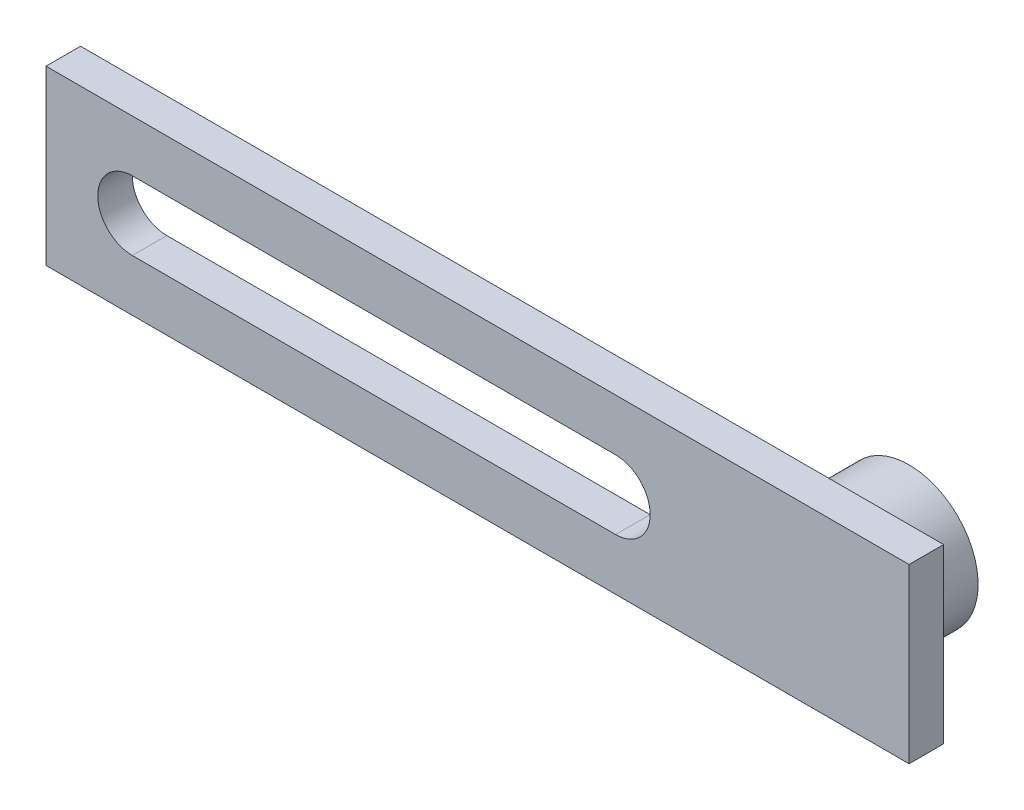
ISO-10303-21;
HEADER;
FILE_DESCRIPTION(('STEP AP214'),'2;1');
FILE_NAME('part.step','',(''),(''),'','','');
FILE_SCHEMA(('AUTOMOTIVE_DESIGN { 1 0 10303 214 1 1 1 1 }'));
ENDSEC;
DATA;
#1=APPLICATION_CONTEXT('core data for automotive mechanical design processes');
#2=APPLICATION_PROTOCOL_DEFINITION('international standard','automotive_design',2000,#1);
#3=PRODUCT_CONTEXT('',#1,'mechanical');
#4=PRODUCT('Part','Part','',(#3));
#5=PRODUCT_RELATED_PRODUCT_CATEGORY('part','',(#4));
#6=PRODUCT_DEFINITION_FORMATION('','',#4);
#7=PRODUCT_DEFINITION_CONTEXT('part definition',#1,'design');
#8=PRODUCT_DEFINITION('design','',#6,#7);
#9=PRODUCT_DEFINITION_SHAPE('','',#8);
#10=(LENGTH_UNIT() NAMED_UNIT(*) SI_UNIT(.MILLI.,.METRE.));
#11=(NAMED_UNIT(*) PLANE_ANGLE_UNIT() SI_UNIT($,.RADIAN.));
#12=(NAMED_UNIT(*) SI_UNIT($,.STERADIAN.) SOLID_ANGLE_UNIT());
#13=UNCERTAINTY_MEASURE_WITH_UNIT(LENGTH_MEASURE(1.E-05),#10,'distance_accuracy_value','');
#14=(GEOMETRIC_REPRESENTATION_CONTEXT(3) GLOBAL_UNCERTAINTY_ASSIGNED_CONTEXT((#13)) GLOBAL_UNIT_ASSIGNED_CONTEXT((#10,
#11,#12)) REPRESENTATION_CONTEXT('',''));
#15=CARTESIAN_POINT('',(0.,0.,0.));
#16=DIRECTION('',(0.,0.,1.));
#17=DIRECTION('',(1.,0.,0.));
#18=AXIS2_PLACEMENT_3D('',#15,#16,#17);
#19=CARTESIAN_POINT('',(0.,0.,0.));
#20=DIRECTION('',(0.,0.,-1.));
#21=DIRECTION('',(-1.,0.,0.));
#22=AXIS2_PLACEMENT_3D('',#19,#20,#21);
#23=PLANE('',#22);
#24=DIRECTION('',(-1.,0.,0.));
#25=VECTOR('',#24,1.);
#26=CARTESIAN_POINT('',(-112.5,-7.50000000000001,0.));
#27=LINE('',#26,#25);
#28=CARTESIAN_POINT('',(-42.5,-7.50000000000002,0.));
#29=VERTEX_POINT('',#28);
#30=CARTESIAN_POINT('',(-112.5,-7.50000000000001,0.));
#31=VERTEX_POINT('',#30);
#32=EDGE_CURVE('E120',#29,#31,#27,.T.);
#33=ORIENTED_EDGE('',*,*,#32,.T.);
#34=CARTESIAN_POINT('',(-112.5,-12.5,0.));
#35=DIRECTION('',(0.,0.,1.));
#36=DIRECTION('',(1.,0.,0.));
#37=AXIS2_PLACEMENT_3D('',#34,#35,#36);
#38=CIRCLE('',#37,5.);
#39=CARTESIAN_POINT('',(-112.5,-17.5,0.));
#40=VERTEX_POINT('',#39);
#41=EDGE_CURVE('E69',#31,#40,#38,.T.);
#42=ORIENTED_EDGE('',*,*,#41,.T.);
#43=DIRECTION('',(1.,0.,0.));
#44=VECTOR('',#43,1.);
#45=CARTESIAN_POINT('',(-112.5,-17.5,0.));
#46=LINE('',#45,#44);
#47=CARTESIAN_POINT('',(-42.5,-17.5,0.));
#48=VERTEX_POINT('',#47);
#49=EDGE_CURVE('E126',#40,#48,#46,.T.);
#50=ORIENTED_EDGE('',*,*,#49,.T.);
#51=CARTESIAN_POINT('',(-42.5,-12.5,0.));
#52=DIRECTION('',(0.,0.,1.));
#53=DIRECTION('',(1.,0.,0.));
#54=AXIS2_PLACEMENT_3D('',#51,#52,#53);
#55=CIRCLE('',#54,5.);
#56=EDGE_CURVE('E142',#48,#29,#55,.T.);
#57=ORIENTED_EDGE('',*,*,#56,.T.);
#58=EDGE_LOOP('',(#33,#42,#50,#57));
#59=FACE_BOUND('',#58,.T.);
#60=DIRECTION('',(0.,1.,0.));
#61=VECTOR('',#60,1.);
#62=CARTESIAN_POINT('',(0.,0.,0.));
#63=LINE('',#62,#61);
#64=CARTESIAN_POINT('',(0.,-25.,0.));
#65=VERTEX_POINT('',#64);
#66=CARTESIAN_POINT('',(0.,0.,0.));
#67=VERTEX_POINT('',#66);
#68=EDGE_CURVE('E127',#65,#67,#63,.T.);
#69=ORIENTED_EDGE('',*,*,#68,.F.);
#70=DIRECTION('',(1.,0.,0.));
#71=VECTOR('',#70,1.);
#72=CARTESIAN_POINT('',(0.,-25.,0.));
#73=LINE('',#72,#71);
#74=CARTESIAN_POINT('',(-125.,-25.,0.));
#75=VERTEX_POINT('',#74);
#76=EDGE_CURVE('E154',#75,#65,#73,.T.);
#77=ORIENTED_EDGE('',*,*,#76,.F.);
#78=DIRECTION('',(0.,-1.,0.));
#79=VECTOR('',#78,1.);
#80=CARTESIAN_POINT('',(-125.,0.,0.));
#81=LINE('',#80,#79);
#82=CARTESIAN_POINT('',(-125.,0.,0.));
#83=VERTEX_POINT('',#82);
#84=EDGE_CURVE('E165',#83,#75,#81,.T.);
#85=ORIENTED_EDGE('',*,*,#84,.F.);
#86=DIRECTION('',(-1.,0.,0.));
#87=VECTOR('',#86,1.);
#88=CARTESIAN_POINT('',(0.,0.,0.));
#89=LINE('',#88,#87);
#90=EDGE_CURVE('E163',#67,#83,#89,.T.);
#91=ORIENTED_EDGE('',*,*,#90,.F.);
#92=EDGE_LOOP('',(#69,#77,#85,#91));
#93=FACE_BOUND('',#92,.T.);
#94=CARTESIAN_POINT('',(-15.,-12.5,0.));
#95=DIRECTION('',(0.,0.,-1.));
#96=DIRECTION('',(-1.,0.,0.));
#97=AXIS2_PLACEMENT_3D('',#94,#95,#96);
#98=CIRCLE('',#97,10.);
#99=CARTESIAN_POINT('',(-25.,-12.5,0.));
#100=VERTEX_POINT('',#99);
#101=EDGE_CURVE('E140',#100,#100,#98,.T.);
#102=ORIENTED_EDGE('',*,*,#101,.F.);
#103=EDGE_LOOP('',(#102));
#104=FACE_BOUND('',#103,.T.);
#105=ADVANCED_FACE('F46',(#59,#93,#104),#23,.T.);
#106=CARTESIAN_POINT('',(0.,0.,5.));
#107=DIRECTION('',(0.,0.,-1.));
#108=DIRECTION('',(-1.,0.,0.));
#109=AXIS2_PLACEMENT_3D('',#106,#107,#108);
#110=PLANE('',#109);
#111=DIRECTION('',(0.,1.,0.));
#112=VECTOR('',#111,1.);
#113=CARTESIAN_POINT('',(0.,0.,5.));
#114=LINE('',#113,#112);
#115=CARTESIAN_POINT('',(0.,-25.,5.));
#116=VERTEX_POINT('',#115);
#117=CARTESIAN_POINT('',(0.,0.,5.));
#118=VERTEX_POINT('',#117);
#119=EDGE_CURVE('E150',#116,#118,#114,.T.);
#120=ORIENTED_EDGE('',*,*,#119,.T.);
#121=DIRECTION('',(-1.,0.,0.));
#122=VECTOR('',#121,1.);
#123=CARTESIAN_POINT('',(0.,0.,5.));
#124=LINE('',#123,#122);
#125=CARTESIAN_POINT('',(-125.,0.,5.));
#126=VERTEX_POINT('',#125);
#127=EDGE_CURVE('E153',#118,#126,#124,.T.);
#128=ORIENTED_EDGE('',*,*,#127,.T.);
#129=DIRECTION('',(0.,-1.,0.));
#130=VECTOR('',#129,1.);
#131=CARTESIAN_POINT('',(-125.,0.,5.));
#132=LINE('',#131,#130);
#133=CARTESIAN_POINT('',(-125.,-25.,5.));
#134=VERTEX_POINT('',#133);
#135=EDGE_CURVE('E156',#126,#134,#132,.T.);
#136=ORIENTED_EDGE('',*,*,#135,.T.);
#137=DIRECTION('',(1.,0.,0.));
#138=VECTOR('',#137,1.);
#139=CARTESIAN_POINT('',(0.,-25.,5.));
#140=LINE('',#139,#138);
#141=EDGE_CURVE('E158',#134,#116,#140,.T.);
#142=ORIENTED_EDGE('',*,*,#141,.T.);
#143=EDGE_LOOP('',(#120,#128,#136,#142));
#144=FACE_BOUND('',#143,.T.);
#145=CARTESIAN_POINT('',(-112.5,-12.5,5.));
#146=DIRECTION('',(0.,0.,1.));
#147=DIRECTION('',(1.,0.,0.));
#148=AXIS2_PLACEMENT_3D('',#145,#146,#147);
#149=CIRCLE('',#148,5.);
#150=CARTESIAN_POINT('',(-112.5,-7.50000000000001,5.));
#151=VERTEX_POINT('',#150);
#152=CARTESIAN_POINT('',(-112.5,-17.5,5.));
#153=VERTEX_POINT('',#152);
#154=EDGE_CURVE('E111',#151,#153,#149,.T.);
#155=ORIENTED_EDGE('',*,*,#154,.F.);
#156=DIRECTION('',(-1.,0.,0.));
#157=VECTOR('',#156,1.);
#158=CARTESIAN_POINT('',(-112.5,-7.50000000000001,5.));
#159=LINE('',#158,#157);
#160=CARTESIAN_POINT('',(-42.5,-7.50000000000002,5.));
#161=VERTEX_POINT('',#160);
#162=EDGE_CURVE('E134',#161,#151,#159,.T.);
#163=ORIENTED_EDGE('',*,*,#162,.F.);
#164=CARTESIAN_POINT('',(-42.5,-12.5,5.));
#165=DIRECTION('',(0.,0.,1.));
#166=DIRECTION('',(1.,0.,0.));
#167=AXIS2_PLACEMENT_3D('',#164,#165,#166);
#168=CIRCLE('',#167,5.);
#169=CARTESIAN_POINT('',(-42.5,-17.5,5.));
#170=VERTEX_POINT('',#169);
#171=EDGE_CURVE('E132',#170,#161,#168,.T.);
#172=ORIENTED_EDGE('',*,*,#171,.F.);
#173=DIRECTION('',(1.,0.,0.));
#174=VECTOR('',#173,1.);
#175=CARTESIAN_POINT('',(-112.5,-17.5,5.));
#176=LINE('',#175,#174);
#177=EDGE_CURVE('E119',#153,#170,#176,.T.);
#178=ORIENTED_EDGE('',*,*,#177,.F.);
#179=EDGE_LOOP('',(#155,#163,#172,#178));
#180=FACE_BOUND('',#179,.T.);
#181=ADVANCED_FACE('F131',(#144,#180),#110,.F.);
#182=CARTESIAN_POINT('',(0.,0.,5.));
#183=DIRECTION('',(-1.,0.,0.));
#184=DIRECTION('',(0.,-1.,0.));
#185=AXIS2_PLACEMENT_3D('',#182,#183,#184);
#186=PLANE('',#185);
#187=ORIENTED_EDGE('',*,*,#68,.T.);
#188=DIRECTION('',(0.,0.,-1.));
#189=VECTOR('',#188,1.);
#190=CARTESIAN_POINT('',(0.,0.,5.));
#191=LINE('',#190,#189);
#192=EDGE_CURVE('E54',#118,#67,#191,.T.);
#193=ORIENTED_EDGE('',*,*,#192,.F.);
#194=ORIENTED_EDGE('',*,*,#119,.F.);
#195=DIRECTION('',(0.,0.,-1.));
#196=VECTOR('',#195,1.);
#197=CARTESIAN_POINT('',(0.,-25.,5.));
#198=LINE('',#197,#196);
#199=EDGE_CURVE('E160',#116,#65,#198,.T.);
#200=ORIENTED_EDGE('',*,*,#199,.T.);
#201=EDGE_LOOP('',(#187,#193,#194,#200));
#202=FACE_BOUND('',#201,.T.);
#203=ADVANCED_FACE('F48',(#202),#186,.F.);
#204=CARTESIAN_POINT('',(0.,0.,5.));
#205=DIRECTION('',(0.,-1.,0.));
#206=DIRECTION('',(0.,0.,-1.));
#207=AXIS2_PLACEMENT_3D('',#204,#205,#206);
#208=PLANE('',#207);
#209=ORIENTED_EDGE('',*,*,#90,.T.);
#210=DIRECTION('',(0.,0.,-1.));
#211=VECTOR('',#210,1.);
#212=CARTESIAN_POINT('',(-125.,0.,5.));
#213=LINE('',#212,#211);
#214=EDGE_CURVE('E173',#126,#83,#213,.T.);
#215=ORIENTED_EDGE('',*,*,#214,.F.);
#216=ORIENTED_EDGE('',*,*,#127,.F.);
#217=ORIENTED_EDGE('',*,*,#192,.T.);
#218=EDGE_LOOP('',(#209,#215,#216,#217));
#219=FACE_BOUND('',#218,.T.);
#220=ADVANCED_FACE('F178',(#219),#208,.F.);
#221=CARTESIAN_POINT('',(-125.,0.,5.));
#222=DIRECTION('',(1.,0.,0.));
#223=DIRECTION('',(0.,0.,-1.));
#224=AXIS2_PLACEMENT_3D('',#221,#222,#223);
#225=PLANE('',#224);
#226=ORIENTED_EDGE('',*,*,#84,.T.);
#227=DIRECTION('',(0.,0.,-1.));
#228=VECTOR('',#227,1.);
#229=CARTESIAN_POINT('',(-125.,-25.,5.));
#230=LINE('',#229,#228);
#231=EDGE_CURVE('E170',#134,#75,#230,.T.);
#232=ORIENTED_EDGE('',*,*,#231,.F.);
#233=ORIENTED_EDGE('',*,*,#135,.F.);
#234=ORIENTED_EDGE('',*,*,#214,.T.);
#235=EDGE_LOOP('',(#226,#232,#233,#234));
#236=FACE_BOUND('',#235,.T.);
#237=ADVANCED_FACE('F190',(#236),#225,.F.);
#238=CARTESIAN_POINT('',(0.,-25.,5.));
#239=DIRECTION('',(0.,1.,0.));
#240=DIRECTION('',(-1.,0.,0.));
#241=AXIS2_PLACEMENT_3D('',#238,#239,#240);
#242=PLANE('',#241);
#243=ORIENTED_EDGE('',*,*,#76,.T.);
#244=ORIENTED_EDGE('',*,*,#199,.F.);
#245=ORIENTED_EDGE('',*,*,#141,.F.);
#246=ORIENTED_EDGE('',*,*,#231,.T.);
#247=EDGE_LOOP('',(#243,#244,#245,#246));
#248=FACE_BOUND('',#247,.T.);
#249=ADVANCED_FACE('F194',(#248),#242,.F.);
#250=CARTESIAN_POINT('',(-112.5,-12.5,5.));
#251=DIRECTION('',(0.,0.,-1.));
#252=DIRECTION('',(-1.,0.,0.));
#253=AXIS2_PLACEMENT_3D('',#250,#251,#252);
#254=CYLINDRICAL_SURFACE('',#253,5.);
#255=ORIENTED_EDGE('',*,*,#41,.F.);
#256=DIRECTION('',(0.,0.,-1.));
#257=VECTOR('',#256,1.);
#258=CARTESIAN_POINT('',(-112.5,-7.50000000000001,5.));
#259=LINE('',#258,#257);
#260=EDGE_CURVE('E115',#151,#31,#259,.T.);
#261=ORIENTED_EDGE('',*,*,#260,.F.);
#262=ORIENTED_EDGE('',*,*,#154,.T.);
#263=DIRECTION('',(0.,0.,-1.));
#264=VECTOR('',#263,1.);
#265=CARTESIAN_POINT('',(-112.5,-17.5,5.));
#266=LINE('',#265,#264);
#267=EDGE_CURVE('E114',#153,#40,#266,.T.);
#268=ORIENTED_EDGE('',*,*,#267,.T.);
#269=EDGE_LOOP('',(#255,#261,#262,#268));
#270=FACE_BOUND('',#269,.T.);
#271=ADVANCED_FACE('F113',(#270),#254,.F.);
#272=CARTESIAN_POINT('',(-112.5,-17.5,5.));
#273=DIRECTION('',(0.,1.,0.));
#274=DIRECTION('',(0.,0.,1.));
#275=AXIS2_PLACEMENT_3D('',#272,#273,#274);
#276=PLANE('',#275);
#277=ORIENTED_EDGE('',*,*,#49,.F.);
#278=ORIENTED_EDGE('',*,*,#267,.F.);
#279=ORIENTED_EDGE('',*,*,#177,.T.);
#280=DIRECTION('',(0.,0.,-1.));
#281=VECTOR('',#280,1.);
#282=CARTESIAN_POINT('',(-42.5,-17.5,5.));
#283=LINE('',#282,#281);
#284=EDGE_CURVE('E128',#170,#48,#283,.T.);
#285=ORIENTED_EDGE('',*,*,#284,.T.);
#286=EDGE_LOOP('',(#277,#278,#279,#285));
#287=FACE_BOUND('',#286,.T.);
#288=ADVANCED_FACE('F123',(#287),#276,.T.);
#289=CARTESIAN_POINT('',(-42.5,-12.5,5.));
#290=DIRECTION('',(0.,0.,-1.));
#291=DIRECTION('',(-1.,0.,0.));
#292=AXIS2_PLACEMENT_3D('',#289,#290,#291);
#293=CYLINDRICAL_SURFACE('',#292,5.);
#294=ORIENTED_EDGE('',*,*,#56,.F.);
#295=ORIENTED_EDGE('',*,*,#284,.F.);
#296=ORIENTED_EDGE('',*,*,#171,.T.);
#297=DIRECTION('',(0.,0.,-1.));
#298=VECTOR('',#297,1.);
#299=CARTESIAN_POINT('',(-42.5,-7.50000000000002,5.));
#300=LINE('',#299,#298);
#301=EDGE_CURVE('E61',#161,#29,#300,.T.);
#302=ORIENTED_EDGE('',*,*,#301,.T.);
#303=EDGE_LOOP('',(#294,#295,#296,#302));
#304=FACE_BOUND('',#303,.T.);
#305=ADVANCED_FACE('F234',(#304),#293,.F.);
#306=CARTESIAN_POINT('',(-112.5,-7.50000000000001,5.));
#307=DIRECTION('',(0.,-1.,0.));
#308=DIRECTION('',(0.,0.,-1.));
#309=AXIS2_PLACEMENT_3D('',#306,#307,#308);
#310=PLANE('',#309);
#311=ORIENTED_EDGE('',*,*,#32,.F.);
#312=ORIENTED_EDGE('',*,*,#301,.F.);
#313=ORIENTED_EDGE('',*,*,#162,.T.);
#314=ORIENTED_EDGE('',*,*,#260,.T.);
#315=EDGE_LOOP('',(#311,#312,#313,#314));
#316=FACE_BOUND('',#315,.T.);
#317=ADVANCED_FACE('F240',(#316),#310,.T.);
#318=CARTESIAN_POINT('',(-15.,-12.5,-5.));
#319=DIRECTION('',(0.,0.,1.));
#320=DIRECTION('',(1.,0.,0.));
#321=AXIS2_PLACEMENT_3D('',#318,#319,#320);
#322=CYLINDRICAL_SURFACE('',#321,10.);
#323=ORIENTED_EDGE('',*,*,#101,.T.);
#324=EDGE_LOOP('',(#323));
#325=FACE_BOUND('',#324,.T.);
#326=CARTESIAN_POINT('',(-15.,-12.5,-10.));
#327=DIRECTION('',(0.,0.,-1.));
#328=DIRECTION('',(-1.,0.,0.));
#329=AXIS2_PLACEMENT_3D('',#326,#327,#328);
#330=CIRCLE('',#329,10.);
#331=CARTESIAN_POINT('',(-25.,-12.5,-10.));
#332=VERTEX_POINT('',#331);
#333=EDGE_CURVE('E295',#332,#332,#330,.T.);
#334=ORIENTED_EDGE('',*,*,#333,.F.);
#335=EDGE_LOOP('',(#334));
#336=FACE_BOUND('',#335,.T.);
#337=ADVANCED_FACE('F248',(#325,#336),#322,.T.);
#338=CARTESIAN_POINT('',(-15.,-12.5,-10.));
#339=DIRECTION('',(0.,0.,-1.));
#340=DIRECTION('',(-1.,0.,0.));
#341=AXIS2_PLACEMENT_3D('',#338,#339,#340);
#342=PLANE('',#341);
#343=ORIENTED_EDGE('',*,*,#333,.T.);
#344=EDGE_LOOP('',(#343));
#345=FACE_BOUND('',#344,.T.);
#346=CARTESIAN_POINT('',(-15.,-12.5,-10.));
#347=DIRECTION('',(0.,0.,-1.));
#348=DIRECTION('',(-1.,0.,0.));
#349=AXIS2_PLACEMENT_3D('',#346,#347,#348);
#350=CIRCLE('',#349,5.);
#351=CARTESIAN_POINT('',(-20.,-12.5,-10.));
#352=VERTEX_POINT('',#351);
#353=EDGE_CURVE('E293',#352,#352,#350,.T.);
#354=ORIENTED_EDGE('',*,*,#353,.F.);
#355=EDGE_LOOP('',(#354));
#356=FACE_BOUND('',#355,.T.);
#357=ADVANCED_FACE('F256',(#345,#356),#342,.T.);
#358=CARTESIAN_POINT('',(-15.,-12.5,-10.));
#359=DIRECTION('',(0.,0.,1.));
#360=DIRECTION('',(1.,0.,0.));
#361=AXIS2_PLACEMENT_3D('',#358,#359,#360);
#362=CYLINDRICAL_SURFACE('',#361,5.);
#363=ORIENTED_EDGE('',*,*,#353,.T.);
#364=EDGE_LOOP('',(#363));
#365=FACE_BOUND('',#364,.T.);
#366=CARTESIAN_POINT('',(-15.,-12.5,-5.));
#367=DIRECTION('',(0.,0.,-1.));
#368=DIRECTION('',(-1.,0.,0.));
#369=AXIS2_PLACEMENT_3D('',#366,#367,#368);
#370=CIRCLE('',#369,5.);
#371=CARTESIAN_POINT('',(-20.,-12.5,-5.));
#372=VERTEX_POINT('',#371);
#373=EDGE_CURVE('E13',#372,#372,#370,.F.);
#374=ORIENTED_EDGE('',*,*,#373,.T.);
#375=EDGE_LOOP('',(#374));
#376=FACE_BOUND('',#375,.T.);
#377=ADVANCED_FACE('F266',(#365,#376),#362,.F.);
#378=CARTESIAN_POINT('',(-15.,-12.5,-5.));
#379=DIRECTION('',(0.,0.,-1.));
#380=DIRECTION('',(-1.,0.,0.));
#381=AXIS2_PLACEMENT_3D('',#378,#379,#380);
#382=PLANE('',#381);
#383=ORIENTED_EDGE('',*,*,#373,.F.);
#384=EDGE_LOOP('',(#383));
#385=FACE_BOUND('',#384,.T.);
#386=ADVANCED_FACE('F274',(#385),#382,.T.);
#387=CLOSED_SHELL('',(#105,#181,#203,#220,#237,#249,#271,#288,#305,#317,#337,#357,#377,#386));
#388=MANIFOLD_SOLID_BREP('B2',#387);
#389=ADVANCED_BREP_SHAPE_REPRESENTATION('',(#18,#388),#14);
#390=SHAPE_DEFINITION_REPRESENTATION(#9,#389);
ENDSEC;
END-ISO-10303-21;
